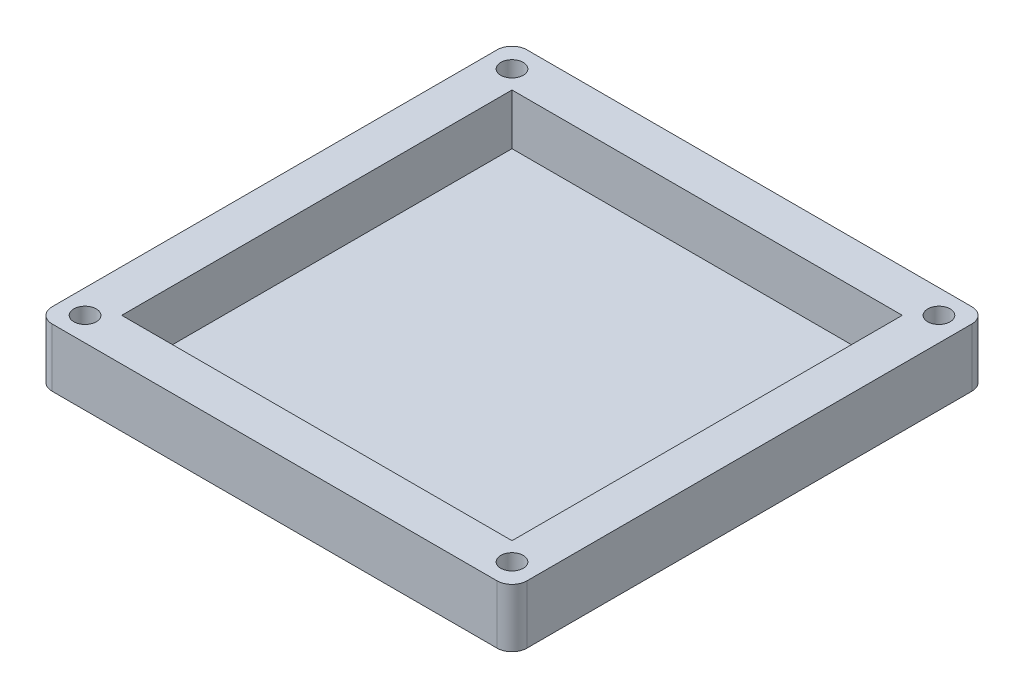
ISO-10303-21;
HEADER;
FILE_DESCRIPTION(('STEP AP214'),'2;1');
FILE_NAME('part.step','',(''),(''),'','','');
FILE_SCHEMA(('AUTOMOTIVE_DESIGN { 1 0 10303 214 1 1 1 1 }'));
ENDSEC;
DATA;
#1=APPLICATION_CONTEXT('core data for automotive mechanical design processes');
#2=APPLICATION_PROTOCOL_DEFINITION('international standard','automotive_design',2000,#1);
#3=PRODUCT_CONTEXT('',#1,'mechanical');
#4=PRODUCT('Part','Part','',(#3));
#5=PRODUCT_RELATED_PRODUCT_CATEGORY('part','',(#4));
#6=PRODUCT_DEFINITION_FORMATION('','',#4);
#7=PRODUCT_DEFINITION_CONTEXT('part definition',#1,'design');
#8=PRODUCT_DEFINITION('design','',#6,#7);
#9=PRODUCT_DEFINITION_SHAPE('','',#8);
#10=(LENGTH_UNIT() NAMED_UNIT(*) SI_UNIT(.MILLI.,.METRE.));
#11=(NAMED_UNIT(*) PLANE_ANGLE_UNIT() SI_UNIT($,.RADIAN.));
#12=(NAMED_UNIT(*) SI_UNIT($,.STERADIAN.) SOLID_ANGLE_UNIT());
#13=UNCERTAINTY_MEASURE_WITH_UNIT(LENGTH_MEASURE(1.E-05),#10,'distance_accuracy_value','');
#14=(GEOMETRIC_REPRESENTATION_CONTEXT(3) GLOBAL_UNCERTAINTY_ASSIGNED_CONTEXT((#13)) GLOBAL_UNIT_ASSIGNED_CONTEXT((#10,
#11,#12)) REPRESENTATION_CONTEXT('',''));
#15=CARTESIAN_POINT('',(0.,0.,0.));
#16=DIRECTION('',(0.,0.,1.));
#17=DIRECTION('',(1.,0.,0.));
#18=AXIS2_PLACEMENT_3D('',#15,#16,#17);
#19=CARTESIAN_POINT('',(0.,7.8,0.));
#20=DIRECTION('',(1.,0.,0.));
#21=DIRECTION('',(0.,0.,-1.));
#22=AXIS2_PLACEMENT_3D('',#19,#20,#21);
#23=PLANE('',#22);
#24=DIRECTION('',(0.,0.,1.));
#25=VECTOR('',#24,1.);
#26=CARTESIAN_POINT('',(0.,7.8,0.));
#27=LINE('',#26,#25);
#28=CARTESIAN_POINT('',(0.,7.8,-61.5));
#29=VERTEX_POINT('',#28);
#30=CARTESIAN_POINT('',(0.,7.8,-2.));
#31=VERTEX_POINT('',#30);
#32=EDGE_CURVE('E191',#29,#31,#27,.T.);
#33=ORIENTED_EDGE('',*,*,#32,.F.);
#34=DIRECTION('',(0.,-1.,0.));
#35=VECTOR('',#34,1.);
#36=CARTESIAN_POINT('',(0.,7.8,-61.5));
#37=LINE('',#36,#35);
#38=CARTESIAN_POINT('',(0.,0.,-61.5));
#39=VERTEX_POINT('',#38);
#40=EDGE_CURVE('E226',#29,#39,#37,.T.);
#41=ORIENTED_EDGE('',*,*,#40,.T.);
#42=DIRECTION('',(0.,0.,1.));
#43=VECTOR('',#42,1.);
#44=CARTESIAN_POINT('',(0.,0.,0.));
#45=LINE('',#44,#43);
#46=CARTESIAN_POINT('',(0.,0.,-2.));
#47=VERTEX_POINT('',#46);
#48=EDGE_CURVE('E188',#39,#47,#45,.T.);
#49=ORIENTED_EDGE('',*,*,#48,.T.);
#50=DIRECTION('',(0.,-1.,0.));
#51=VECTOR('',#50,1.);
#52=CARTESIAN_POINT('',(0.,7.8,-2.));
#53=LINE('',#52,#51);
#54=EDGE_CURVE('E209',#47,#31,#53,.F.);
#55=ORIENTED_EDGE('',*,*,#54,.T.);
#56=EDGE_LOOP('',(#33,#41,#49,#55));
#57=FACE_BOUND('',#56,.T.);
#58=ADVANCED_FACE('F44',(#57),#23,.F.);
#59=CARTESIAN_POINT('',(0.,7.8,0.));
#60=DIRECTION('',(0.,0.,-1.));
#61=DIRECTION('',(-1.,0.,0.));
#62=AXIS2_PLACEMENT_3D('',#59,#60,#61);
#63=PLANE('',#62);
#64=DIRECTION('',(1.,0.,0.));
#65=VECTOR('',#64,1.);
#66=CARTESIAN_POINT('',(0.,0.,0.));
#67=LINE('',#66,#65);
#68=CARTESIAN_POINT('',(2.,0.,0.));
#69=VERTEX_POINT('',#68);
#70=CARTESIAN_POINT('',(61.5,0.,0.));
#71=VERTEX_POINT('',#70);
#72=EDGE_CURVE('E212',#69,#71,#67,.T.);
#73=ORIENTED_EDGE('',*,*,#72,.T.);
#74=DIRECTION('',(0.,-1.,0.));
#75=VECTOR('',#74,1.);
#76=CARTESIAN_POINT('',(61.5,7.8,0.));
#77=LINE('',#76,#75);
#78=CARTESIAN_POINT('',(61.5,7.8,0.));
#79=VERTEX_POINT('',#78);
#80=EDGE_CURVE('E11',#71,#79,#77,.F.);
#81=ORIENTED_EDGE('',*,*,#80,.T.);
#82=DIRECTION('',(1.,0.,0.));
#83=VECTOR('',#82,1.);
#84=CARTESIAN_POINT('',(0.,7.8,0.));
#85=LINE('',#84,#83);
#86=CARTESIAN_POINT('',(2.,7.8,0.));
#87=VERTEX_POINT('',#86);
#88=EDGE_CURVE('E200',#87,#79,#85,.T.);
#89=ORIENTED_EDGE('',*,*,#88,.F.);
#90=DIRECTION('',(0.,-1.,0.));
#91=VECTOR('',#90,1.);
#92=CARTESIAN_POINT('',(2.,7.8,0.));
#93=LINE('',#92,#91);
#94=EDGE_CURVE('E53',#87,#69,#93,.T.);
#95=ORIENTED_EDGE('',*,*,#94,.T.);
#96=EDGE_LOOP('',(#73,#81,#89,#95));
#97=FACE_BOUND('',#96,.T.);
#98=ADVANCED_FACE('F271',(#97),#63,.F.);
#99=CARTESIAN_POINT('',(63.5,7.8,0.));
#100=DIRECTION('',(-1.,0.,0.));
#101=DIRECTION('',(0.,0.,1.));
#102=AXIS2_PLACEMENT_3D('',#99,#100,#101);
#103=PLANE('',#102);
#104=DIRECTION('',(0.,0.,-1.));
#105=VECTOR('',#104,1.);
#106=CARTESIAN_POINT('',(63.5,0.,0.));
#107=LINE('',#106,#105);
#108=CARTESIAN_POINT('',(63.5,0.,-2.));
#109=VERTEX_POINT('',#108);
#110=CARTESIAN_POINT('',(63.5,0.,-61.5));
#111=VERTEX_POINT('',#110);
#112=EDGE_CURVE('E217',#109,#111,#107,.T.);
#113=ORIENTED_EDGE('',*,*,#112,.T.);
#114=DIRECTION('',(0.,-1.,0.));
#115=VECTOR('',#114,1.);
#116=CARTESIAN_POINT('',(63.5,7.8,-61.5));
#117=LINE('',#116,#115);
#118=CARTESIAN_POINT('',(63.5,7.8,-61.5));
#119=VERTEX_POINT('',#118);
#120=EDGE_CURVE('E61',#111,#119,#117,.F.);
#121=ORIENTED_EDGE('',*,*,#120,.T.);
#122=DIRECTION('',(0.,0.,-1.));
#123=VECTOR('',#122,1.);
#124=CARTESIAN_POINT('',(63.5,7.8,0.));
#125=LINE('',#124,#123);
#126=CARTESIAN_POINT('',(63.5,7.8,-2.));
#127=VERTEX_POINT('',#126);
#128=EDGE_CURVE('E201',#127,#119,#125,.T.);
#129=ORIENTED_EDGE('',*,*,#128,.F.);
#130=DIRECTION('',(0.,-1.,0.));
#131=VECTOR('',#130,1.);
#132=CARTESIAN_POINT('',(63.5,7.8,-2.));
#133=LINE('',#132,#131);
#134=EDGE_CURVE('E257',#127,#109,#133,.T.);
#135=ORIENTED_EDGE('',*,*,#134,.T.);
#136=EDGE_LOOP('',(#113,#121,#129,#135));
#137=FACE_BOUND('',#136,.T.);
#138=ADVANCED_FACE('F285',(#137),#103,.F.);
#139=CARTESIAN_POINT('',(0.,7.8,-63.5));
#140=DIRECTION('',(0.,0.,1.));
#141=DIRECTION('',(1.,0.,0.));
#142=AXIS2_PLACEMENT_3D('',#139,#140,#141);
#143=PLANE('',#142);
#144=DIRECTION('',(-1.,0.,0.));
#145=VECTOR('',#144,1.);
#146=CARTESIAN_POINT('',(0.,0.,-63.5));
#147=LINE('',#146,#145);
#148=CARTESIAN_POINT('',(61.5,0.,-63.5));
#149=VERTEX_POINT('',#148);
#150=CARTESIAN_POINT('',(2.,0.,-63.5));
#151=VERTEX_POINT('',#150);
#152=EDGE_CURVE('E199',#149,#151,#147,.T.);
#153=ORIENTED_EDGE('',*,*,#152,.T.);
#154=DIRECTION('',(0.,-1.,0.));
#155=VECTOR('',#154,1.);
#156=CARTESIAN_POINT('',(2.,7.8,-63.5));
#157=LINE('',#156,#155);
#158=CARTESIAN_POINT('',(2.,7.8,-63.5));
#159=VERTEX_POINT('',#158);
#160=EDGE_CURVE('E247',#151,#159,#157,.F.);
#161=ORIENTED_EDGE('',*,*,#160,.T.);
#162=DIRECTION('',(-1.,0.,0.));
#163=VECTOR('',#162,1.);
#164=CARTESIAN_POINT('',(0.,7.8,-63.5));
#165=LINE('',#164,#163);
#166=CARTESIAN_POINT('',(61.5,7.8,-63.5));
#167=VERTEX_POINT('',#166);
#168=EDGE_CURVE('E206',#167,#159,#165,.T.);
#169=ORIENTED_EDGE('',*,*,#168,.F.);
#170=DIRECTION('',(0.,-1.,0.));
#171=VECTOR('',#170,1.);
#172=CARTESIAN_POINT('',(61.5,7.8,-63.5));
#173=LINE('',#172,#171);
#174=EDGE_CURVE('E245',#167,#149,#173,.T.);
#175=ORIENTED_EDGE('',*,*,#174,.T.);
#176=EDGE_LOOP('',(#153,#161,#169,#175));
#177=FACE_BOUND('',#176,.T.);
#178=ADVANCED_FACE('F292',(#177),#143,.F.);
#179=CARTESIAN_POINT('',(0.,7.8,0.));
#180=DIRECTION('',(0.,-1.,0.));
#181=DIRECTION('',(0.,0.,-1.));
#182=AXIS2_PLACEMENT_3D('',#179,#180,#181);
#183=PLANE('',#182);
#184=CARTESIAN_POINT('',(60.3,7.8,-3.2));
#185=DIRECTION('',(0.,1.,0.));
#186=DIRECTION('',(0.,0.,1.));
#187=AXIS2_PLACEMENT_3D('',#184,#185,#186);
#188=CIRCLE('',#187,1.5);
#189=CARTESIAN_POINT('',(60.3,7.8,-1.7));
#190=VERTEX_POINT('',#189);
#191=EDGE_CURVE('E492',#190,#190,#188,.T.);
#192=ORIENTED_EDGE('',*,*,#191,.F.);
#193=EDGE_LOOP('',(#192));
#194=FACE_BOUND('',#193,.T.);
#195=CARTESIAN_POINT('',(60.3,7.8,-60.3));
#196=DIRECTION('',(0.,1.,0.));
#197=DIRECTION('',(0.,0.,1.));
#198=AXIS2_PLACEMENT_3D('',#195,#196,#197);
#199=CIRCLE('',#198,1.5);
#200=CARTESIAN_POINT('',(60.3,7.8,-58.8));
#201=VERTEX_POINT('',#200);
#202=EDGE_CURVE('E500',#201,#201,#199,.T.);
#203=ORIENTED_EDGE('',*,*,#202,.F.);
#204=EDGE_LOOP('',(#203));
#205=FACE_BOUND('',#204,.T.);
#206=CARTESIAN_POINT('',(3.2,7.8,-60.3));
#207=DIRECTION('',(0.,1.,0.));
#208=DIRECTION('',(0.,0.,1.));
#209=AXIS2_PLACEMENT_3D('',#206,#207,#208);
#210=CIRCLE('',#209,1.5);
#211=CARTESIAN_POINT('',(3.2,7.8,-58.8));
#212=VERTEX_POINT('',#211);
#213=EDGE_CURVE('E501',#212,#212,#210,.T.);
#214=ORIENTED_EDGE('',*,*,#213,.F.);
#215=EDGE_LOOP('',(#214));
#216=FACE_BOUND('',#215,.T.);
#217=CARTESIAN_POINT('',(3.2,7.8,-3.2));
#218=DIRECTION('',(0.,1.,0.));
#219=DIRECTION('',(0.,0.,1.));
#220=AXIS2_PLACEMENT_3D('',#217,#218,#219);
#221=CIRCLE('',#220,1.5);
#222=CARTESIAN_POINT('',(3.2,7.8,-1.7));
#223=VERTEX_POINT('',#222);
#224=EDGE_CURVE('E168',#223,#223,#221,.T.);
#225=ORIENTED_EDGE('',*,*,#224,.F.);
#226=EDGE_LOOP('',(#225));
#227=FACE_BOUND('',#226,.T.);
#228=DIRECTION('',(1.,0.,0.));
#229=VECTOR('',#228,1.);
#230=CARTESIAN_POINT('',(5.65,7.8,-5.65));
#231=LINE('',#230,#229);
#232=CARTESIAN_POINT('',(5.65,7.8,-5.65));
#233=VERTEX_POINT('',#232);
#234=CARTESIAN_POINT('',(57.85,7.8,-5.65));
#235=VERTEX_POINT('',#234);
#236=EDGE_CURVE('E179',#233,#235,#231,.T.);
#237=ORIENTED_EDGE('',*,*,#236,.F.);
#238=DIRECTION('',(0.,0.,1.));
#239=VECTOR('',#238,1.);
#240=CARTESIAN_POINT('',(5.65,7.8,-5.65));
#241=LINE('',#240,#239);
#242=CARTESIAN_POINT('',(5.65,7.8,-57.85));
#243=VERTEX_POINT('',#242);
#244=EDGE_CURVE('E141',#243,#233,#241,.T.);
#245=ORIENTED_EDGE('',*,*,#244,.F.);
#246=DIRECTION('',(-1.,0.,0.));
#247=VECTOR('',#246,1.);
#248=CARTESIAN_POINT('',(5.65,7.8,-57.85));
#249=LINE('',#248,#247);
#250=CARTESIAN_POINT('',(57.85,7.8,-57.85));
#251=VERTEX_POINT('',#250);
#252=EDGE_CURVE('E162',#251,#243,#249,.T.);
#253=ORIENTED_EDGE('',*,*,#252,.F.);
#254=DIRECTION('',(0.,0.,-1.));
#255=VECTOR('',#254,1.);
#256=CARTESIAN_POINT('',(57.85,7.8,-5.65));
#257=LINE('',#256,#255);
#258=EDGE_CURVE('E170',#235,#251,#257,.T.);
#259=ORIENTED_EDGE('',*,*,#258,.F.);
#260=EDGE_LOOP('',(#237,#245,#253,#259));
#261=FACE_BOUND('',#260,.T.);
#262=ORIENTED_EDGE('',*,*,#168,.T.);
#263=CARTESIAN_POINT('',(2.,7.8,-61.5));
#264=DIRECTION('',(0.,-1.,0.));
#265=DIRECTION('',(0.,0.,-1.));
#266=AXIS2_PLACEMENT_3D('',#263,#264,#265);
#267=CIRCLE('',#266,2.);
#268=EDGE_CURVE('E260',#159,#29,#267,.F.);
#269=ORIENTED_EDGE('',*,*,#268,.T.);
#270=ORIENTED_EDGE('',*,*,#32,.T.);
#271=CARTESIAN_POINT('',(2.,7.8,-2.));
#272=DIRECTION('',(0.,-1.,0.));
#273=DIRECTION('',(0.,0.,-1.));
#274=AXIS2_PLACEMENT_3D('',#271,#272,#273);
#275=CIRCLE('',#274,2.);
#276=EDGE_CURVE('E249',#31,#87,#275,.F.);
#277=ORIENTED_EDGE('',*,*,#276,.T.);
#278=ORIENTED_EDGE('',*,*,#88,.T.);
#279=CARTESIAN_POINT('',(61.5,7.8,-2.));
#280=DIRECTION('',(0.,-1.,0.));
#281=DIRECTION('',(0.,0.,-1.));
#282=AXIS2_PLACEMENT_3D('',#279,#280,#281);
#283=CIRCLE('',#282,2.);
#284=EDGE_CURVE('E68',#79,#127,#283,.F.);
#285=ORIENTED_EDGE('',*,*,#284,.T.);
#286=ORIENTED_EDGE('',*,*,#128,.T.);
#287=CARTESIAN_POINT('',(61.5,7.8,-61.5));
#288=DIRECTION('',(0.,-1.,0.));
#289=DIRECTION('',(0.,0.,-1.));
#290=AXIS2_PLACEMENT_3D('',#287,#288,#289);
#291=CIRCLE('',#290,2.);
#292=EDGE_CURVE('E255',#119,#167,#291,.F.);
#293=ORIENTED_EDGE('',*,*,#292,.T.);
#294=EDGE_LOOP('',(#262,#269,#270,#277,#278,#285,#286,#293));
#295=FACE_BOUND('',#294,.T.);
#296=ADVANCED_FACE('F283',(#194,#205,#216,#227,#261,#295),#183,.F.);
#297=CARTESIAN_POINT('',(0.,0.,0.));
#298=DIRECTION('',(0.,-1.,0.));
#299=DIRECTION('',(0.,0.,-1.));
#300=AXIS2_PLACEMENT_3D('',#297,#298,#299);
#301=PLANE('',#300);
#302=ORIENTED_EDGE('',*,*,#48,.F.);
#303=CARTESIAN_POINT('',(2.,0.,-61.5));
#304=DIRECTION('',(0.,-1.,0.));
#305=DIRECTION('',(0.,0.,-1.));
#306=AXIS2_PLACEMENT_3D('',#303,#304,#305);
#307=CIRCLE('',#306,2.);
#308=EDGE_CURVE('E239',#39,#151,#307,.T.);
#309=ORIENTED_EDGE('',*,*,#308,.T.);
#310=ORIENTED_EDGE('',*,*,#152,.F.);
#311=CARTESIAN_POINT('',(61.5,0.,-61.5));
#312=DIRECTION('',(0.,-1.,0.));
#313=DIRECTION('',(0.,0.,-1.));
#314=AXIS2_PLACEMENT_3D('',#311,#312,#313);
#315=CIRCLE('',#314,2.);
#316=EDGE_CURVE('E237',#149,#111,#315,.T.);
#317=ORIENTED_EDGE('',*,*,#316,.T.);
#318=ORIENTED_EDGE('',*,*,#112,.F.);
#319=CARTESIAN_POINT('',(61.5,0.,-2.));
#320=DIRECTION('',(0.,-1.,0.));
#321=DIRECTION('',(0.,0.,-1.));
#322=AXIS2_PLACEMENT_3D('',#319,#320,#321);
#323=CIRCLE('',#322,2.);
#324=EDGE_CURVE('E233',#109,#71,#323,.T.);
#325=ORIENTED_EDGE('',*,*,#324,.T.);
#326=ORIENTED_EDGE('',*,*,#72,.F.);
#327=CARTESIAN_POINT('',(2.,0.,-2.));
#328=DIRECTION('',(0.,-1.,0.));
#329=DIRECTION('',(0.,0.,-1.));
#330=AXIS2_PLACEMENT_3D('',#327,#328,#329);
#331=CIRCLE('',#330,2.);
#332=EDGE_CURVE('E229',#69,#47,#331,.T.);
#333=ORIENTED_EDGE('',*,*,#332,.T.);
#334=EDGE_LOOP('',(#302,#309,#310,#317,#318,#325,#326,#333));
#335=FACE_BOUND('',#334,.T.);
#336=ADVANCED_FACE('F280',(#335),#301,.T.);
#337=CARTESIAN_POINT('',(5.65,1.,-5.65));
#338=DIRECTION('',(-1.,0.,0.));
#339=DIRECTION('',(0.,0.,1.));
#340=AXIS2_PLACEMENT_3D('',#337,#338,#339);
#341=PLANE('',#340);
#342=ORIENTED_EDGE('',*,*,#244,.T.);
#343=DIRECTION('',(0.,1.,0.));
#344=VECTOR('',#343,1.);
#345=CARTESIAN_POINT('',(5.65,1.,-5.65));
#346=LINE('',#345,#344);
#347=CARTESIAN_POINT('',(5.65,1.,-5.65));
#348=VERTEX_POINT('',#347);
#349=EDGE_CURVE('E137',#348,#233,#346,.T.);
#350=ORIENTED_EDGE('',*,*,#349,.F.);
#351=DIRECTION('',(0.,0.,1.));
#352=VECTOR('',#351,1.);
#353=CARTESIAN_POINT('',(5.65,1.,-5.65));
#354=LINE('',#353,#352);
#355=CARTESIAN_POINT('',(5.65,1.,-57.85));
#356=VERTEX_POINT('',#355);
#357=EDGE_CURVE('E136',#356,#348,#354,.T.);
#358=ORIENTED_EDGE('',*,*,#357,.F.);
#359=DIRECTION('',(0.,1.,0.));
#360=VECTOR('',#359,1.);
#361=CARTESIAN_POINT('',(5.65,1.,-57.85));
#362=LINE('',#361,#360);
#363=EDGE_CURVE('E186',#356,#243,#362,.T.);
#364=ORIENTED_EDGE('',*,*,#363,.T.);
#365=EDGE_LOOP('',(#342,#350,#358,#364));
#366=FACE_BOUND('',#365,.T.);
#367=ADVANCED_FACE('F138',(#366),#341,.F.);
#368=CARTESIAN_POINT('',(5.65,1.,-57.85));
#369=DIRECTION('',(0.,0.,-1.));
#370=DIRECTION('',(-1.,0.,0.));
#371=AXIS2_PLACEMENT_3D('',#368,#369,#370);
#372=PLANE('',#371);
#373=ORIENTED_EDGE('',*,*,#252,.T.);
#374=ORIENTED_EDGE('',*,*,#363,.F.);
#375=DIRECTION('',(-1.,0.,0.));
#376=VECTOR('',#375,1.);
#377=CARTESIAN_POINT('',(5.65,1.,-57.85));
#378=LINE('',#377,#376);
#379=CARTESIAN_POINT('',(57.85,1.,-57.85));
#380=VERTEX_POINT('',#379);
#381=EDGE_CURVE('E149',#380,#356,#378,.T.);
#382=ORIENTED_EDGE('',*,*,#381,.F.);
#383=DIRECTION('',(0.,1.,0.));
#384=VECTOR('',#383,1.);
#385=CARTESIAN_POINT('',(57.85,1.,-57.85));
#386=LINE('',#385,#384);
#387=EDGE_CURVE('E189',#380,#251,#386,.T.);
#388=ORIENTED_EDGE('',*,*,#387,.T.);
#389=EDGE_LOOP('',(#373,#374,#382,#388));
#390=FACE_BOUND('',#389,.T.);
#391=ADVANCED_FACE('F429',(#390),#372,.F.);
#392=CARTESIAN_POINT('',(57.85,1.,-5.65));
#393=DIRECTION('',(1.,0.,0.));
#394=DIRECTION('',(0.,0.,-1.));
#395=AXIS2_PLACEMENT_3D('',#392,#393,#394);
#396=PLANE('',#395);
#397=ORIENTED_EDGE('',*,*,#258,.T.);
#398=ORIENTED_EDGE('',*,*,#387,.F.);
#399=DIRECTION('',(0.,0.,-1.));
#400=VECTOR('',#399,1.);
#401=CARTESIAN_POINT('',(57.85,1.,-5.65));
#402=LINE('',#401,#400);
#403=CARTESIAN_POINT('',(57.85,1.,-5.65));
#404=VERTEX_POINT('',#403);
#405=EDGE_CURVE('E158',#404,#380,#402,.T.);
#406=ORIENTED_EDGE('',*,*,#405,.F.);
#407=DIRECTION('',(0.,1.,0.));
#408=VECTOR('',#407,1.);
#409=CARTESIAN_POINT('',(57.85,1.,-5.65));
#410=LINE('',#409,#408);
#411=EDGE_CURVE('E146',#404,#235,#410,.T.);
#412=ORIENTED_EDGE('',*,*,#411,.T.);
#413=EDGE_LOOP('',(#397,#398,#406,#412));
#414=FACE_BOUND('',#413,.T.);
#415=ADVANCED_FACE('F425',(#414),#396,.F.);
#416=CARTESIAN_POINT('',(5.65,1.,-5.65));
#417=DIRECTION('',(0.,0.,1.));
#418=DIRECTION('',(1.,0.,0.));
#419=AXIS2_PLACEMENT_3D('',#416,#417,#418);
#420=PLANE('',#419);
#421=ORIENTED_EDGE('',*,*,#236,.T.);
#422=ORIENTED_EDGE('',*,*,#411,.F.);
#423=DIRECTION('',(1.,0.,0.));
#424=VECTOR('',#423,1.);
#425=CARTESIAN_POINT('',(5.65,1.,-5.65));
#426=LINE('',#425,#424);
#427=EDGE_CURVE('E155',#348,#404,#426,.T.);
#428=ORIENTED_EDGE('',*,*,#427,.F.);
#429=ORIENTED_EDGE('',*,*,#349,.T.);
#430=EDGE_LOOP('',(#421,#422,#428,#429));
#431=FACE_BOUND('',#430,.T.);
#432=ADVANCED_FACE('F153',(#431),#420,.F.);
#433=CARTESIAN_POINT('',(0.,1.,0.));
#434=DIRECTION('',(0.,-1.,0.));
#435=DIRECTION('',(0.,0.,-1.));
#436=AXIS2_PLACEMENT_3D('',#433,#434,#435);
#437=PLANE('',#436);
#438=ORIENTED_EDGE('',*,*,#357,.T.);
#439=ORIENTED_EDGE('',*,*,#427,.T.);
#440=ORIENTED_EDGE('',*,*,#405,.T.);
#441=ORIENTED_EDGE('',*,*,#381,.T.);
#442=EDGE_LOOP('',(#438,#439,#440,#441));
#443=FACE_BOUND('',#442,.T.);
#444=ADVANCED_FACE('F159',(#443),#437,.F.);
#445=CARTESIAN_POINT('',(3.2,0.3,-3.2));
#446=DIRECTION('',(0.,1.,0.));
#447=DIRECTION('',(0.,0.,1.));
#448=AXIS2_PLACEMENT_3D('',#445,#446,#447);
#449=CYLINDRICAL_SURFACE('',#448,1.5);
#450=CARTESIAN_POINT('',(3.2,0.3,-3.2));
#451=DIRECTION('',(0.,1.,0.));
#452=DIRECTION('',(0.,0.,1.));
#453=AXIS2_PLACEMENT_3D('',#450,#451,#452);
#454=CIRCLE('',#453,1.5);
#455=CARTESIAN_POINT('',(3.2,0.3,-1.7));
#456=VERTEX_POINT('',#455);
#457=EDGE_CURVE('E176',#456,#456,#454,.T.);
#458=ORIENTED_EDGE('',*,*,#457,.F.);
#459=EDGE_LOOP('',(#458));
#460=FACE_BOUND('',#459,.T.);
#461=ORIENTED_EDGE('',*,*,#224,.T.);
#462=EDGE_LOOP('',(#461));
#463=FACE_BOUND('',#462,.T.);
#464=ADVANCED_FACE('F398',(#460,#463),#449,.F.);
#465=CARTESIAN_POINT('',(3.2,0.3,-3.2));
#466=DIRECTION('',(0.,1.,0.));
#467=DIRECTION('',(0.,0.,1.));
#468=AXIS2_PLACEMENT_3D('',#465,#466,#467);
#469=PLANE('',#468);
#470=ORIENTED_EDGE('',*,*,#457,.T.);
#471=EDGE_LOOP('',(#470));
#472=FACE_BOUND('',#471,.T.);
#473=ADVANCED_FACE('F386',(#472),#469,.T.);
#474=CARTESIAN_POINT('',(3.2,0.3,-60.3));
#475=DIRECTION('',(0.,1.,0.));
#476=DIRECTION('',(0.,0.,1.));
#477=AXIS2_PLACEMENT_3D('',#474,#475,#476);
#478=CYLINDRICAL_SURFACE('',#477,1.5);
#479=CARTESIAN_POINT('',(3.2,0.3,-60.3));
#480=DIRECTION('',(0.,1.,0.));
#481=DIRECTION('',(0.,0.,1.));
#482=AXIS2_PLACEMENT_3D('',#479,#480,#481);
#483=CIRCLE('',#482,1.5);
#484=CARTESIAN_POINT('',(3.2,0.3,-58.8));
#485=VERTEX_POINT('',#484);
#486=EDGE_CURVE('E515',#485,#485,#483,.T.);
#487=ORIENTED_EDGE('',*,*,#486,.F.);
#488=EDGE_LOOP('',(#487));
#489=FACE_BOUND('',#488,.T.);
#490=ORIENTED_EDGE('',*,*,#213,.T.);
#491=EDGE_LOOP('',(#490));
#492=FACE_BOUND('',#491,.T.);
#493=ADVANCED_FACE('F379',(#489,#492),#478,.F.);
#494=CARTESIAN_POINT('',(3.2,0.3,-60.3));
#495=DIRECTION('',(0.,1.,0.));
#496=DIRECTION('',(0.,0.,1.));
#497=AXIS2_PLACEMENT_3D('',#494,#495,#496);
#498=PLANE('',#497);
#499=ORIENTED_EDGE('',*,*,#486,.T.);
#500=EDGE_LOOP('',(#499));
#501=FACE_BOUND('',#500,.T.);
#502=ADVANCED_FACE('F371',(#501),#498,.T.);
#503=CARTESIAN_POINT('',(60.3,0.3,-60.3));
#504=DIRECTION('',(0.,1.,0.));
#505=DIRECTION('',(0.,0.,1.));
#506=AXIS2_PLACEMENT_3D('',#503,#504,#505);
#507=CYLINDRICAL_SURFACE('',#506,1.5);
#508=CARTESIAN_POINT('',(60.3,0.3,-60.3));
#509=DIRECTION('',(0.,1.,0.));
#510=DIRECTION('',(0.,0.,1.));
#511=AXIS2_PLACEMENT_3D('',#508,#509,#510);
#512=CIRCLE('',#511,1.5);
#513=CARTESIAN_POINT('',(60.3,0.3,-58.8));
#514=VERTEX_POINT('',#513);
#515=EDGE_CURVE('E522',#514,#514,#512,.T.);
#516=ORIENTED_EDGE('',*,*,#515,.F.);
#517=EDGE_LOOP('',(#516));
#518=FACE_BOUND('',#517,.T.);
#519=ORIENTED_EDGE('',*,*,#202,.T.);
#520=EDGE_LOOP('',(#519));
#521=FACE_BOUND('',#520,.T.);
#522=ADVANCED_FACE('F362',(#518,#521),#507,.F.);
#523=CARTESIAN_POINT('',(60.3,0.3,-60.3));
#524=DIRECTION('',(0.,1.,0.));
#525=DIRECTION('',(0.,0.,1.));
#526=AXIS2_PLACEMENT_3D('',#523,#524,#525);
#527=PLANE('',#526);
#528=ORIENTED_EDGE('',*,*,#515,.T.);
#529=EDGE_LOOP('',(#528));
#530=FACE_BOUND('',#529,.T.);
#531=ADVANCED_FACE('F352',(#530),#527,.T.);
#532=CARTESIAN_POINT('',(60.3,0.3,-3.2));
#533=DIRECTION('',(0.,1.,0.));
#534=DIRECTION('',(0.,0.,1.));
#535=AXIS2_PLACEMENT_3D('',#532,#533,#534);
#536=CYLINDRICAL_SURFACE('',#535,1.5);
#537=CARTESIAN_POINT('',(60.3,0.3,-3.2));
#538=DIRECTION('',(0.,1.,0.));
#539=DIRECTION('',(0.,0.,1.));
#540=AXIS2_PLACEMENT_3D('',#537,#538,#539);
#541=CIRCLE('',#540,1.5);
#542=CARTESIAN_POINT('',(60.3,0.3,-1.7));
#543=VERTEX_POINT('',#542);
#544=EDGE_CURVE('E527',#543,#543,#541,.T.);
#545=ORIENTED_EDGE('',*,*,#544,.F.);
#546=EDGE_LOOP('',(#545));
#547=FACE_BOUND('',#546,.T.);
#548=ORIENTED_EDGE('',*,*,#191,.T.);
#549=EDGE_LOOP('',(#548));
#550=FACE_BOUND('',#549,.T.);
#551=ADVANCED_FACE('F344',(#547,#550),#536,.F.);
#552=CARTESIAN_POINT('',(60.3,0.3,-3.2));
#553=DIRECTION('',(0.,1.,0.));
#554=DIRECTION('',(0.,0.,1.));
#555=AXIS2_PLACEMENT_3D('',#552,#553,#554);
#556=PLANE('',#555);
#557=ORIENTED_EDGE('',*,*,#544,.T.);
#558=EDGE_LOOP('',(#557));
#559=FACE_BOUND('',#558,.T.);
#560=ADVANCED_FACE('F312',(#559),#556,.T.);
#561=CARTESIAN_POINT('',(2.,7.8,-61.5));
#562=DIRECTION('',(0.,-1.,0.));
#563=DIRECTION('',(0.,0.,-1.));
#564=AXIS2_PLACEMENT_3D('',#561,#562,#563);
#565=CYLINDRICAL_SURFACE('',#564,2.);
#566=ORIENTED_EDGE('',*,*,#268,.F.);
#567=ORIENTED_EDGE('',*,*,#160,.F.);
#568=ORIENTED_EDGE('',*,*,#308,.F.);
#569=ORIENTED_EDGE('',*,*,#40,.F.);
#570=EDGE_LOOP('',(#566,#567,#568,#569));
#571=FACE_BOUND('',#570,.T.);
#572=ADVANCED_FACE('F296',(#571),#565,.T.);
#573=CARTESIAN_POINT('',(61.5,7.8,-61.5));
#574=DIRECTION('',(0.,-1.,0.));
#575=DIRECTION('',(0.,0.,-1.));
#576=AXIS2_PLACEMENT_3D('',#573,#574,#575);
#577=CYLINDRICAL_SURFACE('',#576,2.);
#578=ORIENTED_EDGE('',*,*,#292,.F.);
#579=ORIENTED_EDGE('',*,*,#120,.F.);
#580=ORIENTED_EDGE('',*,*,#316,.F.);
#581=ORIENTED_EDGE('',*,*,#174,.F.);
#582=EDGE_LOOP('',(#578,#579,#580,#581));
#583=FACE_BOUND('',#582,.T.);
#584=ADVANCED_FACE('F288',(#583),#577,.T.);
#585=CARTESIAN_POINT('',(61.5,7.8,-2.));
#586=DIRECTION('',(0.,-1.,0.));
#587=DIRECTION('',(0.,0.,-1.));
#588=AXIS2_PLACEMENT_3D('',#585,#586,#587);
#589=CYLINDRICAL_SURFACE('',#588,2.);
#590=ORIENTED_EDGE('',*,*,#284,.F.);
#591=ORIENTED_EDGE('',*,*,#80,.F.);
#592=ORIENTED_EDGE('',*,*,#324,.F.);
#593=ORIENTED_EDGE('',*,*,#134,.F.);
#594=EDGE_LOOP('',(#590,#591,#592,#593));
#595=FACE_BOUND('',#594,.T.);
#596=ADVANCED_FACE('F281',(#595),#589,.T.);
#597=CARTESIAN_POINT('',(2.,7.8,-2.));
#598=DIRECTION('',(0.,-1.,0.));
#599=DIRECTION('',(0.,0.,-1.));
#600=AXIS2_PLACEMENT_3D('',#597,#598,#599);
#601=CYLINDRICAL_SURFACE('',#600,2.);
#602=ORIENTED_EDGE('',*,*,#276,.F.);
#603=ORIENTED_EDGE('',*,*,#54,.F.);
#604=ORIENTED_EDGE('',*,*,#332,.F.);
#605=ORIENTED_EDGE('',*,*,#94,.F.);
#606=EDGE_LOOP('',(#602,#603,#604,#605));
#607=FACE_BOUND('',#606,.T.);
#608=ADVANCED_FACE('F50',(#607),#601,.T.);
#609=CLOSED_SHELL('',(#58,#98,#138,#178,#296,#336,#367,#391,#415,#432,#444,#464,#473,#493,#502,
#522,#531,#551,#560,#572,#584,#596,#608));
#610=MANIFOLD_SOLID_BREP('B2',#609);
#611=ADVANCED_BREP_SHAPE_REPRESENTATION('',(#18,#610),#14);
#612=SHAPE_DEFINITION_REPRESENTATION(#9,#611);
ENDSEC;
END-ISO-10303-21;
